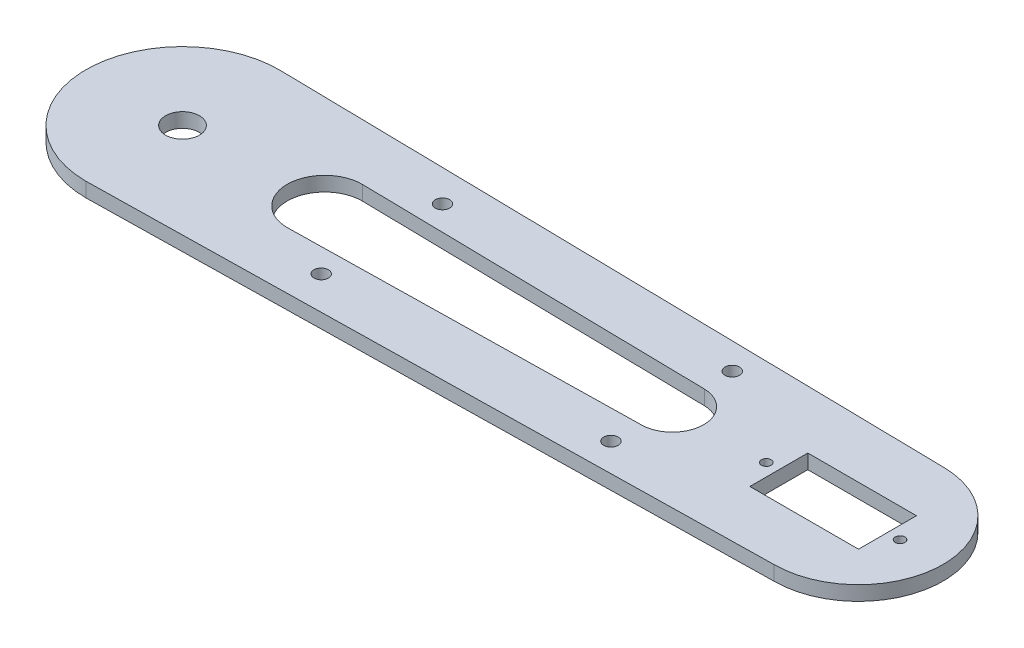
ISO-10303-21;
HEADER;
FILE_DESCRIPTION(('STEP AP214'),'2;1');
FILE_NAME('part.step','',(''),(''),'','','');
FILE_SCHEMA(('AUTOMOTIVE_DESIGN { 1 0 10303 214 1 1 1 1 }'));
ENDSEC;
DATA;
#1=APPLICATION_CONTEXT('core data for automotive mechanical design processes');
#2=APPLICATION_PROTOCOL_DEFINITION('international standard','automotive_design',2000,#1);
#3=PRODUCT_CONTEXT('',#1,'mechanical');
#4=PRODUCT('Part','Part','',(#3));
#5=PRODUCT_RELATED_PRODUCT_CATEGORY('part','',(#4));
#6=PRODUCT_DEFINITION_FORMATION('','',#4);
#7=PRODUCT_DEFINITION_CONTEXT('part definition',#1,'design');
#8=PRODUCT_DEFINITION('design','',#6,#7);
#9=PRODUCT_DEFINITION_SHAPE('','',#8);
#10=(LENGTH_UNIT() NAMED_UNIT(*) SI_UNIT(.MILLI.,.METRE.));
#11=(NAMED_UNIT(*) PLANE_ANGLE_UNIT() SI_UNIT($,.RADIAN.));
#12=(NAMED_UNIT(*) SI_UNIT($,.STERADIAN.) SOLID_ANGLE_UNIT());
#13=UNCERTAINTY_MEASURE_WITH_UNIT(LENGTH_MEASURE(1.E-05),#10,'distance_accuracy_value','');
#14=(GEOMETRIC_REPRESENTATION_CONTEXT(3) GLOBAL_UNCERTAINTY_ASSIGNED_CONTEXT((#13)) GLOBAL_UNIT_ASSIGNED_CONTEXT((#10,
#11,#12)) REPRESENTATION_CONTEXT('',''));
#15=CARTESIAN_POINT('',(0.,0.,0.));
#16=DIRECTION('',(0.,0.,1.));
#17=DIRECTION('',(1.,0.,0.));
#18=AXIS2_PLACEMENT_3D('',#15,#16,#17);
#19=CARTESIAN_POINT('',(0.,3.,0.));
#20=DIRECTION('',(0.,1.,0.));
#21=DIRECTION('',(0.,0.,1.));
#22=AXIS2_PLACEMENT_3D('',#19,#20,#21);
#23=PLANE('',#22);
#24=CARTESIAN_POINT('',(100.994069634501,3.,-12.8483172188178));
#25=DIRECTION('',(0.,1.,0.));
#26=DIRECTION('',(0.,0.,-1.));
#27=AXIS2_PLACEMENT_3D('',#24,#25,#26);
#28=CIRCLE('',#27,1.50000000000001);
#29=CARTESIAN_POINT('',(100.994069634501,3.,-14.3483172188178));
#30=VERTEX_POINT('',#29);
#31=EDGE_CURVE('E330',#30,#30,#28,.T.);
#32=ORIENTED_EDGE('',*,*,#31,.F.);
#33=EDGE_LOOP('',(#32));
#34=FACE_BOUND('',#33,.T.);
#35=CARTESIAN_POINT('',(100.994069634501,3.,12.2668470597705));
#36=DIRECTION('',(0.,1.,0.));
#37=DIRECTION('',(0.,0.,-1.));
#38=AXIS2_PLACEMENT_3D('',#35,#36,#37);
#39=CIRCLE('',#38,1.50000000000001);
#40=CARTESIAN_POINT('',(100.994069634501,3.,10.7668470597705));
#41=VERTEX_POINT('',#40);
#42=EDGE_CURVE('E334',#41,#41,#39,.T.);
#43=ORIENTED_EDGE('',*,*,#42,.F.);
#44=EDGE_LOOP('',(#43));
#45=FACE_BOUND('',#44,.T.);
#46=CARTESIAN_POINT('',(40.9940696345014,3.,12.2668470597705));
#47=DIRECTION('',(0.,1.,0.));
#48=DIRECTION('',(0.,0.,1.));
#49=AXIS2_PLACEMENT_3D('',#46,#47,#48);
#50=CIRCLE('',#49,1.5);
#51=CARTESIAN_POINT('',(40.9940696345014,3.,13.7668470597705));
#52=VERTEX_POINT('',#51);
#53=EDGE_CURVE('E338',#52,#52,#50,.T.);
#54=ORIENTED_EDGE('',*,*,#53,.F.);
#55=EDGE_LOOP('',(#54));
#56=FACE_BOUND('',#55,.T.);
#57=CARTESIAN_POINT('',(40.9940696345014,3.,-12.8483172188178));
#58=DIRECTION('',(0.,1.,0.));
#59=DIRECTION('',(0.,0.,1.));
#60=AXIS2_PLACEMENT_3D('',#57,#58,#59);
#61=CIRCLE('',#60,1.5);
#62=CARTESIAN_POINT('',(40.9940696345014,3.,-11.3483172188178));
#63=VERTEX_POINT('',#62);
#64=EDGE_CURVE('E162',#63,#63,#61,.T.);
#65=ORIENTED_EDGE('',*,*,#64,.F.);
#66=EDGE_LOOP('',(#65));
#67=FACE_BOUND('',#66,.T.);
#68=CARTESIAN_POINT('',(0.,3.,0.));
#69=DIRECTION('',(0.,1.,0.));
#70=DIRECTION('',(0.,0.,1.));
#71=AXIS2_PLACEMENT_3D('',#68,#69,#70);
#72=CIRCLE('',#71,3.5);
#73=CARTESIAN_POINT('',(0.,3.,3.5));
#74=VERTEX_POINT('',#73);
#75=EDGE_CURVE('E12',#74,#74,#72,.T.);
#76=ORIENTED_EDGE('',*,*,#75,.F.);
#77=EDGE_LOOP('',(#76));
#78=FACE_BOUND('',#77,.T.);
#79=DIRECTION('',(0.,0.,1.));
#80=VECTOR('',#79,1.);
#81=CARTESIAN_POINT('',(123.5,3.,-6.));
#82=LINE('',#81,#80);
#83=CARTESIAN_POINT('',(123.5,3.,-6.));
#84=VERTEX_POINT('',#83);
#85=CARTESIAN_POINT('',(123.5,3.,6.));
#86=VERTEX_POINT('',#85);
#87=EDGE_CURVE('E241',#84,#86,#82,.T.);
#88=ORIENTED_EDGE('',*,*,#87,.F.);
#89=DIRECTION('',(-1.,0.,0.));
#90=VECTOR('',#89,1.);
#91=CARTESIAN_POINT('',(123.5,3.,-6.));
#92=LINE('',#91,#90);
#93=CARTESIAN_POINT('',(146.,3.,-6.));
#94=VERTEX_POINT('',#93);
#95=EDGE_CURVE('E257',#94,#84,#92,.T.);
#96=ORIENTED_EDGE('',*,*,#95,.F.);
#97=DIRECTION('',(0.,0.,-1.));
#98=VECTOR('',#97,1.);
#99=CARTESIAN_POINT('',(146.,3.,-6.));
#100=LINE('',#99,#98);
#101=CARTESIAN_POINT('',(146.,3.,6.));
#102=VERTEX_POINT('',#101);
#103=EDGE_CURVE('E253',#102,#94,#100,.T.);
#104=ORIENTED_EDGE('',*,*,#103,.F.);
#105=DIRECTION('',(1.,0.,0.));
#106=VECTOR('',#105,1.);
#107=CARTESIAN_POINT('',(123.5,3.,6.));
#108=LINE('',#107,#106);
#109=EDGE_CURVE('E249',#86,#102,#108,.T.);
#110=ORIENTED_EDGE('',*,*,#109,.F.);
#111=EDGE_LOOP('',(#88,#96,#104,#110));
#112=FACE_BOUND('',#111,.T.);
#113=CARTESIAN_POINT('',(148.6,3.,0.));
#114=DIRECTION('',(0.,1.,0.));
#115=DIRECTION('',(0.,0.,1.));
#116=AXIS2_PLACEMENT_3D('',#113,#114,#115);
#117=CIRCLE('',#116,0.999999999999998);
#118=CARTESIAN_POINT('',(148.6,3.,0.999999999999998));
#119=VERTEX_POINT('',#118);
#120=EDGE_CURVE('E233',#119,#119,#117,.T.);
#121=ORIENTED_EDGE('',*,*,#120,.F.);
#122=EDGE_LOOP('',(#121));
#123=FACE_BOUND('',#122,.T.);
#124=CARTESIAN_POINT('',(120.9,3.,0.));
#125=DIRECTION('',(0.,1.,0.));
#126=DIRECTION('',(0.,0.,1.));
#127=AXIS2_PLACEMENT_3D('',#124,#125,#126);
#128=CIRCLE('',#127,0.999999999999998);
#129=CARTESIAN_POINT('',(120.9,3.,1.00000000000001));
#130=VERTEX_POINT('',#129);
#131=EDGE_CURVE('E209',#130,#130,#128,.T.);
#132=ORIENTED_EDGE('',*,*,#131,.F.);
#133=EDGE_LOOP('',(#132));
#134=FACE_BOUND('',#133,.T.);
#135=DIRECTION('',(-0.999840599345445,0.,0.0178542964168829));
#136=VECTOR('',#135,1.);
#137=CARTESIAN_POINT('',(0.357029008606949,3.,19.9936244819892));
#138=LINE('',#137,#136);
#139=CARTESIAN_POINT('',(140.,3.,17.5));
#140=VERTEX_POINT('',#139);
#141=CARTESIAN_POINT('',(0.,3.,20.));
#142=VERTEX_POINT('',#141);
#143=EDGE_CURVE('E180',#140,#142,#138,.T.);
#144=ORIENTED_EDGE('',*,*,#143,.F.);
#145=CARTESIAN_POINT('',(140.,3.,0.));
#146=DIRECTION('',(0.,1.,0.));
#147=DIRECTION('',(0.,0.,1.));
#148=AXIS2_PLACEMENT_3D('',#145,#146,#147);
#149=CIRCLE('',#148,17.5);
#150=CARTESIAN_POINT('',(140.3125,3.,-17.4972095989618));
#151=VERTEX_POINT('',#150);
#152=EDGE_CURVE('E198',#140,#151,#149,.T.);
#153=ORIENTED_EDGE('',*,*,#152,.T.);
#154=DIRECTION('',(0.999840548512101,0.,0.0178571428571428));
#155=VECTOR('',#154,1.);
#156=CARTESIAN_POINT('',(0.357142857142856,3.,-19.996810970242));
#157=LINE('',#156,#155);
#158=CARTESIAN_POINT('',(0.357142857142857,3.,-19.996810970242));
#159=VERTEX_POINT('',#158);
#160=EDGE_CURVE('E189',#159,#151,#157,.T.);
#161=ORIENTED_EDGE('',*,*,#160,.F.);
#162=CARTESIAN_POINT('',(0.,3.,0.));
#163=DIRECTION('',(0.,1.,0.));
#164=DIRECTION('',(0.,0.,1.));
#165=AXIS2_PLACEMENT_3D('',#162,#163,#164);
#166=CIRCLE('',#165,20.);
#167=EDGE_CURVE('E218',#159,#142,#166,.T.);
#168=ORIENTED_EDGE('',*,*,#167,.T.);
#169=EDGE_LOOP('',(#144,#153,#161,#168));
#170=FACE_BOUND('',#169,.T.);
#171=DIRECTION('',(-0.999840548512101,0.,-0.0178571428571486));
#172=VECTOR('',#171,1.);
#173=CARTESIAN_POINT('',(0.153184026665754,3.,-8.57693766970494));
#174=LINE('',#173,#172);
#175=CARTESIAN_POINT('',(101.283865866767,3.,-6.77074463667885));
#176=VERTEX_POINT('',#175);
#177=CARTESIAN_POINT('',(29.1730446968037,3.,-8.05864322920403));
#178=VERTEX_POINT('',#177);
#179=EDGE_CURVE('E171',#176,#178,#174,.T.);
#180=ORIENTED_EDGE('',*,*,#179,.F.);
#181=CARTESIAN_POINT('',(101.157834128344,3.,-0.288766187509077));
#182=DIRECTION('',(0.,1.,0.));
#183=DIRECTION('',(0.,0.,1.));
#184=AXIS2_PLACEMENT_3D('',#181,#182,#183);
#185=CIRCLE('',#184,6.48320357651921);
#186=CARTESIAN_POINT('',(101.494647455368,3.,6.18568246834806));
#187=VERTEX_POINT('',#186);
#188=EDGE_CURVE('E60',#176,#187,#185,.F.);
#189=ORIENTED_EDGE('',*,*,#188,.T.);
#190=DIRECTION('',(0.999840599345445,0.,-0.0178542964168771));
#191=VECTOR('',#190,1.);
#192=CARTESIAN_POINT('',(0.142777451604297,3.,7.99553728984324));
#193=LINE('',#192,#191);
#194=CARTESIAN_POINT('',(29.1575998035354,3.,7.47741546213036));
#195=VERTEX_POINT('',#194);
#196=EDGE_CURVE('E154',#195,#187,#193,.T.);
#197=ORIENTED_EDGE('',*,*,#196,.F.);
#198=CARTESIAN_POINT('',(29.1653222501695,3.,-0.290613883536413));
#199=DIRECTION('',(0.,1.,0.));
#200=DIRECTION('',(0.,0.,1.));
#201=AXIS2_PLACEMENT_3D('',#198,#199,#200);
#202=CIRCLE('',#201,7.76803318423194);
#203=EDGE_CURVE('E159',#178,#195,#202,.T.);
#204=ORIENTED_EDGE('',*,*,#203,.F.);
#205=EDGE_LOOP('',(#180,#189,#197,#204));
#206=FACE_BOUND('',#205,.T.);
#207=ADVANCED_FACE('F43',(#34,#45,#56,#67,#78,#112,#123,#134,#170,#206),#23,.T.);
#208=CARTESIAN_POINT('',(0.,0.,0.));
#209=DIRECTION('',(0.,1.,0.));
#210=DIRECTION('',(0.,0.,1.));
#211=AXIS2_PLACEMENT_3D('',#208,#209,#210);
#212=PLANE('',#211);
#213=CARTESIAN_POINT('',(100.994069634501,0.,-12.8483172188178));
#214=DIRECTION('',(0.,1.,0.));
#215=DIRECTION('',(0.,0.,1.));
#216=AXIS2_PLACEMENT_3D('',#213,#214,#215);
#217=CIRCLE('',#216,1.50000000000001);
#218=CARTESIAN_POINT('',(100.994069634501,0.,-11.3483172188178));
#219=VERTEX_POINT('',#218);
#220=EDGE_CURVE('E46',#219,#219,#217,.T.);
#221=ORIENTED_EDGE('',*,*,#220,.T.);
#222=EDGE_LOOP('',(#221));
#223=FACE_BOUND('',#222,.T.);
#224=CARTESIAN_POINT('',(100.994069634501,0.,12.2668470597705));
#225=DIRECTION('',(0.,1.,0.));
#226=DIRECTION('',(0.,0.,1.));
#227=AXIS2_PLACEMENT_3D('',#224,#225,#226);
#228=CIRCLE('',#227,1.50000000000001);
#229=CARTESIAN_POINT('',(100.994069634501,0.,13.7668470597705));
#230=VERTEX_POINT('',#229);
#231=EDGE_CURVE('E297',#230,#230,#228,.T.);
#232=ORIENTED_EDGE('',*,*,#231,.T.);
#233=EDGE_LOOP('',(#232));
#234=FACE_BOUND('',#233,.T.);
#235=CARTESIAN_POINT('',(40.9940696345014,0.,12.2668470597705));
#236=DIRECTION('',(0.,1.,0.));
#237=DIRECTION('',(0.,0.,1.));
#238=AXIS2_PLACEMENT_3D('',#235,#236,#237);
#239=CIRCLE('',#238,1.5);
#240=CARTESIAN_POINT('',(40.9940696345014,0.,13.7668470597705));
#241=VERTEX_POINT('',#240);
#242=EDGE_CURVE('E294',#241,#241,#239,.T.);
#243=ORIENTED_EDGE('',*,*,#242,.T.);
#244=EDGE_LOOP('',(#243));
#245=FACE_BOUND('',#244,.T.);
#246=CARTESIAN_POINT('',(40.9940696345014,0.,-12.8483172188178));
#247=DIRECTION('',(0.,1.,0.));
#248=DIRECTION('',(0.,0.,1.));
#249=AXIS2_PLACEMENT_3D('',#246,#247,#248);
#250=CIRCLE('',#249,1.5);
#251=CARTESIAN_POINT('',(40.9940696345014,0.,-11.3483172188178));
#252=VERTEX_POINT('',#251);
#253=EDGE_CURVE('E290',#252,#252,#250,.T.);
#254=ORIENTED_EDGE('',*,*,#253,.T.);
#255=EDGE_LOOP('',(#254));
#256=FACE_BOUND('',#255,.T.);
#257=DIRECTION('',(-0.999840599345445,0.,0.0178542964168829));
#258=VECTOR('',#257,1.);
#259=CARTESIAN_POINT('',(0.357029008606949,0.,19.9936244819892));
#260=LINE('',#259,#258);
#261=CARTESIAN_POINT('',(140.,0.,17.5));
#262=VERTEX_POINT('',#261);
#263=CARTESIAN_POINT('',(0.,0.,20.));
#264=VERTEX_POINT('',#263);
#265=EDGE_CURVE('E210',#262,#264,#260,.T.);
#266=ORIENTED_EDGE('',*,*,#265,.T.);
#267=CARTESIAN_POINT('',(0.,0.,0.));
#268=DIRECTION('',(0.,1.,0.));
#269=DIRECTION('',(0.,0.,1.));
#270=AXIS2_PLACEMENT_3D('',#267,#268,#269);
#271=CIRCLE('',#270,20.);
#272=CARTESIAN_POINT('',(0.357142857142857,0.,-19.996810970242));
#273=VERTEX_POINT('',#272);
#274=EDGE_CURVE('E194',#273,#264,#271,.T.);
#275=ORIENTED_EDGE('',*,*,#274,.F.);
#276=DIRECTION('',(0.999840548512101,0.,0.0178571428571428));
#277=VECTOR('',#276,1.);
#278=CARTESIAN_POINT('',(0.357142857142856,0.,-19.996810970242));
#279=LINE('',#278,#277);
#280=CARTESIAN_POINT('',(140.3125,0.,-17.4972095989618));
#281=VERTEX_POINT('',#280);
#282=EDGE_CURVE('E205',#273,#281,#279,.T.);
#283=ORIENTED_EDGE('',*,*,#282,.T.);
#284=CARTESIAN_POINT('',(140.,0.,0.));
#285=DIRECTION('',(0.,1.,0.));
#286=DIRECTION('',(0.,0.,1.));
#287=AXIS2_PLACEMENT_3D('',#284,#285,#286);
#288=CIRCLE('',#287,17.5);
#289=EDGE_CURVE('E190',#262,#281,#288,.T.);
#290=ORIENTED_EDGE('',*,*,#289,.F.);
#291=EDGE_LOOP('',(#266,#275,#283,#290));
#292=FACE_BOUND('',#291,.T.);
#293=CARTESIAN_POINT('',(120.9,0.,0.));
#294=DIRECTION('',(0.,1.,0.));
#295=DIRECTION('',(0.,0.,1.));
#296=AXIS2_PLACEMENT_3D('',#293,#294,#295);
#297=CIRCLE('',#296,0.999999999999998);
#298=CARTESIAN_POINT('',(120.9,0.,1.00000000000001));
#299=VERTEX_POINT('',#298);
#300=EDGE_CURVE('E217',#299,#299,#297,.T.);
#301=ORIENTED_EDGE('',*,*,#300,.T.);
#302=EDGE_LOOP('',(#301));
#303=FACE_BOUND('',#302,.T.);
#304=CARTESIAN_POINT('',(148.6,0.,0.));
#305=DIRECTION('',(0.,1.,0.));
#306=DIRECTION('',(0.,0.,1.));
#307=AXIS2_PLACEMENT_3D('',#304,#305,#306);
#308=CIRCLE('',#307,0.999999999999998);
#309=CARTESIAN_POINT('',(148.6,0.,0.999999999999998));
#310=VERTEX_POINT('',#309);
#311=EDGE_CURVE('E237',#310,#310,#308,.T.);
#312=ORIENTED_EDGE('',*,*,#311,.T.);
#313=EDGE_LOOP('',(#312));
#314=FACE_BOUND('',#313,.T.);
#315=DIRECTION('',(-1.,0.,0.));
#316=VECTOR('',#315,1.);
#317=CARTESIAN_POINT('',(123.5,0.,-6.));
#318=LINE('',#317,#316);
#319=CARTESIAN_POINT('',(146.,0.,-6.));
#320=VERTEX_POINT('',#319);
#321=CARTESIAN_POINT('',(123.5,0.,-6.));
#322=VERTEX_POINT('',#321);
#323=EDGE_CURVE('E272',#320,#322,#318,.T.);
#324=ORIENTED_EDGE('',*,*,#323,.T.);
#325=DIRECTION('',(0.,0.,1.));
#326=VECTOR('',#325,1.);
#327=CARTESIAN_POINT('',(123.5,0.,-6.));
#328=LINE('',#327,#326);
#329=CARTESIAN_POINT('',(123.5,0.,6.));
#330=VERTEX_POINT('',#329);
#331=EDGE_CURVE('E276',#322,#330,#328,.T.);
#332=ORIENTED_EDGE('',*,*,#331,.T.);
#333=DIRECTION('',(1.,0.,0.));
#334=VECTOR('',#333,1.);
#335=CARTESIAN_POINT('',(123.5,0.,6.));
#336=LINE('',#335,#334);
#337=CARTESIAN_POINT('',(146.,0.,6.));
#338=VERTEX_POINT('',#337);
#339=EDGE_CURVE('E280',#330,#338,#336,.T.);
#340=ORIENTED_EDGE('',*,*,#339,.T.);
#341=DIRECTION('',(0.,0.,-1.));
#342=VECTOR('',#341,1.);
#343=CARTESIAN_POINT('',(146.,0.,-6.));
#344=LINE('',#343,#342);
#345=EDGE_CURVE('E245',#338,#320,#344,.T.);
#346=ORIENTED_EDGE('',*,*,#345,.T.);
#347=EDGE_LOOP('',(#324,#332,#340,#346));
#348=FACE_BOUND('',#347,.T.);
#349=CARTESIAN_POINT('',(0.,0.,0.));
#350=DIRECTION('',(0.,1.,0.));
#351=DIRECTION('',(0.,0.,1.));
#352=AXIS2_PLACEMENT_3D('',#349,#350,#351);
#353=CIRCLE('',#352,3.5);
#354=CARTESIAN_POINT('',(0.,0.,3.5));
#355=VERTEX_POINT('',#354);
#356=EDGE_CURVE('E221',#355,#355,#353,.T.);
#357=ORIENTED_EDGE('',*,*,#356,.T.);
#358=EDGE_LOOP('',(#357));
#359=FACE_BOUND('',#358,.T.);
#360=CARTESIAN_POINT('',(101.157834128344,0.,-0.288766187509077));
#361=DIRECTION('',(0.,1.,0.));
#362=DIRECTION('',(0.,0.,1.));
#363=AXIS2_PLACEMENT_3D('',#360,#361,#362);
#364=CIRCLE('',#363,6.48320357651921);
#365=CARTESIAN_POINT('',(101.283865866767,0.,-6.77074463667885));
#366=VERTEX_POINT('',#365);
#367=CARTESIAN_POINT('',(101.494647455368,0.,6.18568246834806));
#368=VERTEX_POINT('',#367);
#369=EDGE_CURVE('E135',#366,#368,#364,.F.);
#370=ORIENTED_EDGE('',*,*,#369,.F.);
#371=DIRECTION('',(-0.999840548512101,0.,-0.0178571428571486));
#372=VECTOR('',#371,1.);
#373=CARTESIAN_POINT('',(0.153184026665754,0.,-8.57693766970494));
#374=LINE('',#373,#372);
#375=CARTESIAN_POINT('',(29.1730446968037,0.,-8.05864322920403));
#376=VERTEX_POINT('',#375);
#377=EDGE_CURVE('E145',#366,#376,#374,.T.);
#378=ORIENTED_EDGE('',*,*,#377,.T.);
#379=CARTESIAN_POINT('',(29.1653222501695,0.,-0.290613883536413));
#380=DIRECTION('',(0.,1.,0.));
#381=DIRECTION('',(0.,0.,1.));
#382=AXIS2_PLACEMENT_3D('',#379,#380,#381);
#383=CIRCLE('',#382,7.76803318423194);
#384=CARTESIAN_POINT('',(29.1575998035354,0.,7.47741546213036));
#385=VERTEX_POINT('',#384);
#386=EDGE_CURVE('E68',#376,#385,#383,.T.);
#387=ORIENTED_EDGE('',*,*,#386,.T.);
#388=DIRECTION('',(0.999840599345445,0.,-0.0178542964168771));
#389=VECTOR('',#388,1.);
#390=CARTESIAN_POINT('',(0.142777451604297,0.,7.99553728984324));
#391=LINE('',#390,#389);
#392=EDGE_CURVE('E142',#385,#368,#391,.T.);
#393=ORIENTED_EDGE('',*,*,#392,.T.);
#394=EDGE_LOOP('',(#370,#378,#387,#393));
#395=FACE_BOUND('',#394,.T.);
#396=ADVANCED_FACE('F151',(#223,#234,#245,#256,#292,#303,#314,#348,#359,#395),#212,.F.);
#397=CARTESIAN_POINT('',(0.357029008606949,3.,19.9936244819892));
#398=DIRECTION('',(0.0178542964168829,0.,0.999840599345445));
#399=DIRECTION('',(0.999840599345445,0.,-0.0178542964168829));
#400=AXIS2_PLACEMENT_3D('',#397,#398,#399);
#401=PLANE('',#400);
#402=ORIENTED_EDGE('',*,*,#265,.F.);
#403=DIRECTION('',(0.,-1.,0.));
#404=VECTOR('',#403,1.);
#405=CARTESIAN_POINT('',(140.,3.,17.5));
#406=LINE('',#405,#404);
#407=EDGE_CURVE('E186',#140,#262,#406,.T.);
#408=ORIENTED_EDGE('',*,*,#407,.F.);
#409=ORIENTED_EDGE('',*,*,#143,.T.);
#410=DIRECTION('',(0.,-1.,0.));
#411=VECTOR('',#410,1.);
#412=CARTESIAN_POINT('',(0.,3.,20.));
#413=LINE('',#412,#411);
#414=EDGE_CURVE('E199',#142,#264,#413,.T.);
#415=ORIENTED_EDGE('',*,*,#414,.T.);
#416=EDGE_LOOP('',(#402,#408,#409,#415));
#417=FACE_BOUND('',#416,.T.);
#418=ADVANCED_FACE('F327',(#417),#401,.T.);
#419=CARTESIAN_POINT('',(140.,3.,0.));
#420=DIRECTION('',(0.,-1.,0.));
#421=DIRECTION('',(0.,0.,-1.));
#422=AXIS2_PLACEMENT_3D('',#419,#420,#421);
#423=CYLINDRICAL_SURFACE('',#422,17.5);
#424=ORIENTED_EDGE('',*,*,#289,.T.);
#425=DIRECTION('',(0.,-1.,0.));
#426=VECTOR('',#425,1.);
#427=CARTESIAN_POINT('',(140.3125,3.,-17.4972095989618));
#428=LINE('',#427,#426);
#429=EDGE_CURVE('E191',#151,#281,#428,.T.);
#430=ORIENTED_EDGE('',*,*,#429,.F.);
#431=ORIENTED_EDGE('',*,*,#152,.F.);
#432=ORIENTED_EDGE('',*,*,#407,.T.);
#433=EDGE_LOOP('',(#424,#430,#431,#432));
#434=FACE_BOUND('',#433,.T.);
#435=ADVANCED_FACE('F374',(#434),#423,.T.);
#436=CARTESIAN_POINT('',(0.357142857142856,3.,-19.996810970242));
#437=DIRECTION('',(0.0178571428571428,0.,-0.999840548512101));
#438=DIRECTION('',(-0.999840548512101,0.,-0.0178571428571428));
#439=AXIS2_PLACEMENT_3D('',#436,#437,#438);
#440=PLANE('',#439);
#441=ORIENTED_EDGE('',*,*,#282,.F.);
#442=DIRECTION('',(0.,-1.,0.));
#443=VECTOR('',#442,1.);
#444=CARTESIAN_POINT('',(0.357142857142857,3.,-19.996810970242));
#445=LINE('',#444,#443);
#446=EDGE_CURVE('E195',#159,#273,#445,.T.);
#447=ORIENTED_EDGE('',*,*,#446,.F.);
#448=ORIENTED_EDGE('',*,*,#160,.T.);
#449=ORIENTED_EDGE('',*,*,#429,.T.);
#450=EDGE_LOOP('',(#441,#447,#448,#449));
#451=FACE_BOUND('',#450,.T.);
#452=ADVANCED_FACE('F378',(#451),#440,.T.);
#453=CARTESIAN_POINT('',(0.,3.,0.));
#454=DIRECTION('',(0.,-1.,0.));
#455=DIRECTION('',(0.,0.,-1.));
#456=AXIS2_PLACEMENT_3D('',#453,#454,#455);
#457=CYLINDRICAL_SURFACE('',#456,20.);
#458=ORIENTED_EDGE('',*,*,#274,.T.);
#459=ORIENTED_EDGE('',*,*,#414,.F.);
#460=ORIENTED_EDGE('',*,*,#167,.F.);
#461=ORIENTED_EDGE('',*,*,#446,.T.);
#462=EDGE_LOOP('',(#458,#459,#460,#461));
#463=FACE_BOUND('',#462,.T.);
#464=ADVANCED_FACE('F382',(#463),#457,.T.);
#465=CARTESIAN_POINT('',(120.9,0.,0.));
#466=DIRECTION('',(0.,1.,0.));
#467=DIRECTION('',(0.,0.,1.));
#468=AXIS2_PLACEMENT_3D('',#465,#466,#467);
#469=CYLINDRICAL_SURFACE('',#468,0.999999999999998);
#470=ORIENTED_EDGE('',*,*,#300,.F.);
#471=EDGE_LOOP('',(#470));
#472=FACE_BOUND('',#471,.T.);
#473=ORIENTED_EDGE('',*,*,#131,.T.);
#474=EDGE_LOOP('',(#473));
#475=FACE_BOUND('',#474,.T.);
#476=ADVANCED_FACE('F386',(#472,#475),#469,.F.);
#477=CARTESIAN_POINT('',(148.6,0.,0.));
#478=DIRECTION('',(0.,1.,0.));
#479=DIRECTION('',(0.,0.,1.));
#480=AXIS2_PLACEMENT_3D('',#477,#478,#479);
#481=CYLINDRICAL_SURFACE('',#480,0.999999999999998);
#482=ORIENTED_EDGE('',*,*,#311,.F.);
#483=EDGE_LOOP('',(#482));
#484=FACE_BOUND('',#483,.T.);
#485=ORIENTED_EDGE('',*,*,#120,.T.);
#486=EDGE_LOOP('',(#485));
#487=FACE_BOUND('',#486,.T.);
#488=ADVANCED_FACE('F390',(#484,#487),#481,.F.);
#489=CARTESIAN_POINT('',(123.5,0.,-6.));
#490=DIRECTION('',(-1.,0.,0.));
#491=DIRECTION('',(0.,0.,1.));
#492=AXIS2_PLACEMENT_3D('',#489,#490,#491);
#493=PLANE('',#492);
#494=ORIENTED_EDGE('',*,*,#87,.T.);
#495=DIRECTION('',(0.,1.,0.));
#496=VECTOR('',#495,1.);
#497=CARTESIAN_POINT('',(123.5,0.,6.));
#498=LINE('',#497,#496);
#499=EDGE_CURVE('E52',#330,#86,#498,.T.);
#500=ORIENTED_EDGE('',*,*,#499,.F.);
#501=ORIENTED_EDGE('',*,*,#331,.F.);
#502=DIRECTION('',(0.,1.,0.));
#503=VECTOR('',#502,1.);
#504=CARTESIAN_POINT('',(123.5,0.,-6.));
#505=LINE('',#504,#503);
#506=EDGE_CURVE('E258',#322,#84,#505,.T.);
#507=ORIENTED_EDGE('',*,*,#506,.T.);
#508=EDGE_LOOP('',(#494,#500,#501,#507));
#509=FACE_BOUND('',#508,.T.);
#510=ADVANCED_FACE('F394',(#509),#493,.F.);
#511=CARTESIAN_POINT('',(123.5,0.,-6.));
#512=DIRECTION('',(0.,0.,-1.));
#513=DIRECTION('',(-1.,0.,0.));
#514=AXIS2_PLACEMENT_3D('',#511,#512,#513);
#515=PLANE('',#514);
#516=ORIENTED_EDGE('',*,*,#95,.T.);
#517=ORIENTED_EDGE('',*,*,#506,.F.);
#518=ORIENTED_EDGE('',*,*,#323,.F.);
#519=DIRECTION('',(0.,1.,0.));
#520=VECTOR('',#519,1.);
#521=CARTESIAN_POINT('',(146.,0.,-6.));
#522=LINE('',#521,#520);
#523=EDGE_CURVE('E254',#320,#94,#522,.T.);
#524=ORIENTED_EDGE('',*,*,#523,.T.);
#525=EDGE_LOOP('',(#516,#517,#518,#524));
#526=FACE_BOUND('',#525,.T.);
#527=ADVANCED_FACE('F398',(#526),#515,.F.);
#528=CARTESIAN_POINT('',(146.,0.,-6.));
#529=DIRECTION('',(1.,0.,0.));
#530=DIRECTION('',(0.,0.,-1.));
#531=AXIS2_PLACEMENT_3D('',#528,#529,#530);
#532=PLANE('',#531);
#533=ORIENTED_EDGE('',*,*,#103,.T.);
#534=ORIENTED_EDGE('',*,*,#523,.F.);
#535=ORIENTED_EDGE('',*,*,#345,.F.);
#536=DIRECTION('',(0.,1.,0.));
#537=VECTOR('',#536,1.);
#538=CARTESIAN_POINT('',(146.,0.,6.));
#539=LINE('',#538,#537);
#540=EDGE_CURVE('E250',#338,#102,#539,.T.);
#541=ORIENTED_EDGE('',*,*,#540,.T.);
#542=EDGE_LOOP('',(#533,#534,#535,#541));
#543=FACE_BOUND('',#542,.T.);
#544=ADVANCED_FACE('F403',(#543),#532,.F.);
#545=CARTESIAN_POINT('',(123.5,0.,6.));
#546=DIRECTION('',(0.,0.,1.));
#547=DIRECTION('',(1.,0.,0.));
#548=AXIS2_PLACEMENT_3D('',#545,#546,#547);
#549=PLANE('',#548);
#550=ORIENTED_EDGE('',*,*,#109,.T.);
#551=ORIENTED_EDGE('',*,*,#540,.F.);
#552=ORIENTED_EDGE('',*,*,#339,.F.);
#553=ORIENTED_EDGE('',*,*,#499,.T.);
#554=EDGE_LOOP('',(#550,#551,#552,#553));
#555=FACE_BOUND('',#554,.T.);
#556=ADVANCED_FACE('F400',(#555),#549,.F.);
#557=CARTESIAN_POINT('',(0.,0.,0.));
#558=DIRECTION('',(0.,1.,0.));
#559=DIRECTION('',(0.,0.,1.));
#560=AXIS2_PLACEMENT_3D('',#557,#558,#559);
#561=CYLINDRICAL_SURFACE('',#560,3.5);
#562=ORIENTED_EDGE('',*,*,#356,.F.);
#563=EDGE_LOOP('',(#562));
#564=FACE_BOUND('',#563,.T.);
#565=ORIENTED_EDGE('',*,*,#75,.T.);
#566=EDGE_LOOP('',(#565));
#567=FACE_BOUND('',#566,.T.);
#568=ADVANCED_FACE('F366',(#564,#567),#561,.F.);
#569=CARTESIAN_POINT('',(101.157834128344,0.,-0.288766187509077));
#570=DIRECTION('',(0.,1.,0.));
#571=DIRECTION('',(0.,0.,1.));
#572=AXIS2_PLACEMENT_3D('',#569,#570,#571);
#573=CYLINDRICAL_SURFACE('',#572,6.48320357651921);
#574=ORIENTED_EDGE('',*,*,#188,.F.);
#575=DIRECTION('',(0.,1.,0.));
#576=VECTOR('',#575,1.);
#577=CARTESIAN_POINT('',(101.283865866767,0.,-6.77074463667885));
#578=LINE('',#577,#576);
#579=EDGE_CURVE('E131',#366,#176,#578,.T.);
#580=ORIENTED_EDGE('',*,*,#579,.F.);
#581=ORIENTED_EDGE('',*,*,#369,.T.);
#582=DIRECTION('',(0.,1.,0.));
#583=VECTOR('',#582,1.);
#584=CARTESIAN_POINT('',(101.494647455368,0.,6.18568246834806));
#585=LINE('',#584,#583);
#586=EDGE_CURVE('E177',#368,#187,#585,.T.);
#587=ORIENTED_EDGE('',*,*,#586,.T.);
#588=EDGE_LOOP('',(#574,#580,#581,#587));
#589=FACE_BOUND('',#588,.T.);
#590=ADVANCED_FACE('F133',(#589),#573,.F.);
#591=CARTESIAN_POINT('',(0.142777451604297,0.,7.99553728984324));
#592=DIRECTION('',(0.0178542964168771,0.,0.999840599345445));
#593=DIRECTION('',(0.999840599345445,0.,-0.0178542964168771));
#594=AXIS2_PLACEMENT_3D('',#591,#592,#593);
#595=PLANE('',#594);
#596=ORIENTED_EDGE('',*,*,#196,.T.);
#597=ORIENTED_EDGE('',*,*,#586,.F.);
#598=ORIENTED_EDGE('',*,*,#392,.F.);
#599=DIRECTION('',(0.,1.,0.));
#600=VECTOR('',#599,1.);
#601=CARTESIAN_POINT('',(29.1575998035354,0.,7.47741546213036));
#602=LINE('',#601,#600);
#603=EDGE_CURVE('E181',#385,#195,#602,.T.);
#604=ORIENTED_EDGE('',*,*,#603,.T.);
#605=EDGE_LOOP('',(#596,#597,#598,#604));
#606=FACE_BOUND('',#605,.T.);
#607=ADVANCED_FACE('F358',(#606),#595,.F.);
#608=CARTESIAN_POINT('',(29.1653222501695,0.,-0.290613883536413));
#609=DIRECTION('',(0.,1.,0.));
#610=DIRECTION('',(0.,0.,1.));
#611=AXIS2_PLACEMENT_3D('',#608,#609,#610);
#612=CYLINDRICAL_SURFACE('',#611,7.76803318423194);
#613=ORIENTED_EDGE('',*,*,#203,.T.);
#614=ORIENTED_EDGE('',*,*,#603,.F.);
#615=ORIENTED_EDGE('',*,*,#386,.F.);
#616=DIRECTION('',(0.,1.,0.));
#617=VECTOR('',#616,1.);
#618=CARTESIAN_POINT('',(29.1730446968037,0.,-8.05864322920403));
#619=LINE('',#618,#617);
#620=EDGE_CURVE('E141',#376,#178,#619,.T.);
#621=ORIENTED_EDGE('',*,*,#620,.T.);
#622=EDGE_LOOP('',(#613,#614,#615,#621));
#623=FACE_BOUND('',#622,.T.);
#624=ADVANCED_FACE('F356',(#623),#612,.F.);
#625=CARTESIAN_POINT('',(0.153184026665754,0.,-8.57693766970494));
#626=DIRECTION('',(0.0178571428571486,0.,-0.999840548512101));
#627=DIRECTION('',(-0.999840548512101,0.,-0.0178571428571486));
#628=AXIS2_PLACEMENT_3D('',#625,#626,#627);
#629=PLANE('',#628);
#630=ORIENTED_EDGE('',*,*,#179,.T.);
#631=ORIENTED_EDGE('',*,*,#620,.F.);
#632=ORIENTED_EDGE('',*,*,#377,.F.);
#633=ORIENTED_EDGE('',*,*,#579,.T.);
#634=EDGE_LOOP('',(#630,#631,#632,#633));
#635=FACE_BOUND('',#634,.T.);
#636=ADVANCED_FACE('F146',(#635),#629,.F.);
#637=CARTESIAN_POINT('',(40.9940696345014,-7.,-12.8483172188178));
#638=DIRECTION('',(0.,1.,0.));
#639=DIRECTION('',(0.,0.,1.));
#640=AXIS2_PLACEMENT_3D('',#637,#638,#639);
#641=CYLINDRICAL_SURFACE('',#640,1.5);
#642=ORIENTED_EDGE('',*,*,#64,.T.);
#643=EDGE_LOOP('',(#642));
#644=FACE_BOUND('',#643,.T.);
#645=ORIENTED_EDGE('',*,*,#253,.F.);
#646=EDGE_LOOP('',(#645));
#647=FACE_BOUND('',#646,.T.);
#648=ADVANCED_FACE('F368',(#644,#647),#641,.F.);
#649=CARTESIAN_POINT('',(40.9940696345014,-7.,12.2668470597705));
#650=DIRECTION('',(0.,1.,0.));
#651=DIRECTION('',(0.,0.,1.));
#652=AXIS2_PLACEMENT_3D('',#649,#650,#651);
#653=CYLINDRICAL_SURFACE('',#652,1.5);
#654=ORIENTED_EDGE('',*,*,#53,.T.);
#655=EDGE_LOOP('',(#654));
#656=FACE_BOUND('',#655,.T.);
#657=ORIENTED_EDGE('',*,*,#242,.F.);
#658=EDGE_LOOP('',(#657));
#659=FACE_BOUND('',#658,.T.);
#660=ADVANCED_FACE('F317',(#656,#659),#653,.F.);
#661=CARTESIAN_POINT('',(100.994069634501,-7.,12.2668470597705));
#662=DIRECTION('',(0.,1.,0.));
#663=DIRECTION('',(0.,0.,1.));
#664=AXIS2_PLACEMENT_3D('',#661,#662,#663);
#665=CYLINDRICAL_SURFACE('',#664,1.50000000000001);
#666=ORIENTED_EDGE('',*,*,#42,.T.);
#667=EDGE_LOOP('',(#666));
#668=FACE_BOUND('',#667,.T.);
#669=ORIENTED_EDGE('',*,*,#231,.F.);
#670=EDGE_LOOP('',(#669));
#671=FACE_BOUND('',#670,.T.);
#672=ADVANCED_FACE('F311',(#668,#671),#665,.F.);
#673=CARTESIAN_POINT('',(100.994069634501,-7.,-12.8483172188178));
#674=DIRECTION('',(0.,1.,0.));
#675=DIRECTION('',(0.,0.,1.));
#676=AXIS2_PLACEMENT_3D('',#673,#674,#675);
#677=CYLINDRICAL_SURFACE('',#676,1.50000000000001);
#678=ORIENTED_EDGE('',*,*,#31,.T.);
#679=EDGE_LOOP('',(#678));
#680=FACE_BOUND('',#679,.T.);
#681=ORIENTED_EDGE('',*,*,#220,.F.);
#682=EDGE_LOOP('',(#681));
#683=FACE_BOUND('',#682,.T.);
#684=ADVANCED_FACE('F309',(#680,#683),#677,.F.);
#685=CLOSED_SHELL('',(#207,#396,#418,#435,#452,#464,#476,#488,#510,#527,#544,#556,#568,#590,
#607,#624,#636,#648,#660,#672,#684));
#686=MANIFOLD_SOLID_BREP('B2',#685);
#687=ADVANCED_BREP_SHAPE_REPRESENTATION('',(#18,#686),#14);
#688=SHAPE_DEFINITION_REPRESENTATION(#9,#687);
ENDSEC;
END-ISO-10303-21;
